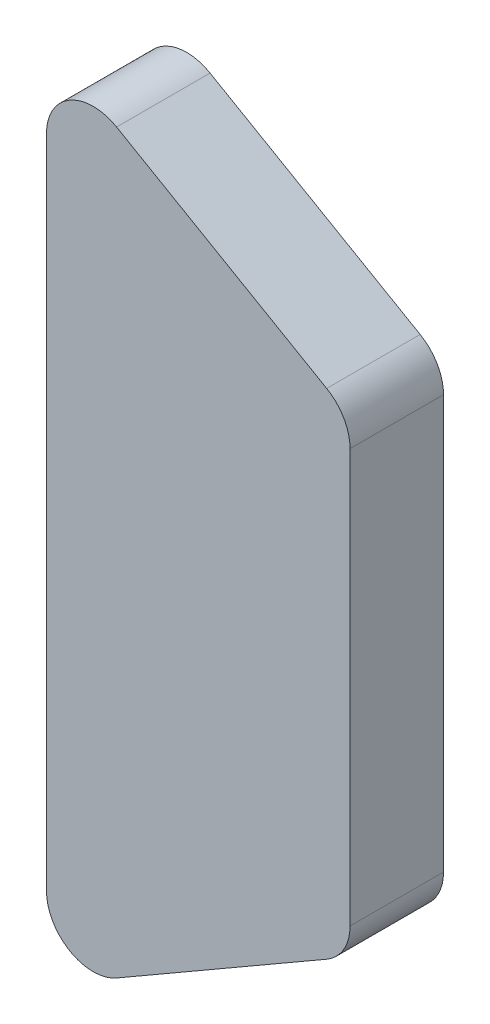
ISO-10303-21;
HEADER;
FILE_DESCRIPTION(('STEP AP214'),'2;1');
FILE_NAME('part.step','',(''),(''),'','','');
FILE_SCHEMA(('AUTOMOTIVE_DESIGN { 1 0 10303 214 1 1 1 1 }'));
ENDSEC;
DATA;
#1=APPLICATION_CONTEXT('core data for automotive mechanical design processes');
#2=APPLICATION_PROTOCOL_DEFINITION('international standard','automotive_design',2000,#1);
#3=PRODUCT_CONTEXT('',#1,'mechanical');
#4=PRODUCT('Part','Part','',(#3));
#5=PRODUCT_RELATED_PRODUCT_CATEGORY('part','',(#4));
#6=PRODUCT_DEFINITION_FORMATION('','',#4);
#7=PRODUCT_DEFINITION_CONTEXT('part definition',#1,'design');
#8=PRODUCT_DEFINITION('design','',#6,#7);
#9=PRODUCT_DEFINITION_SHAPE('','',#8);
#10=(LENGTH_UNIT() NAMED_UNIT(*) SI_UNIT(.MILLI.,.METRE.));
#11=(NAMED_UNIT(*) PLANE_ANGLE_UNIT() SI_UNIT($,.RADIAN.));
#12=(NAMED_UNIT(*) SI_UNIT($,.STERADIAN.) SOLID_ANGLE_UNIT());
#13=UNCERTAINTY_MEASURE_WITH_UNIT(LENGTH_MEASURE(1.E-05),#10,'distance_accuracy_value','');
#14=(GEOMETRIC_REPRESENTATION_CONTEXT(3) GLOBAL_UNCERTAINTY_ASSIGNED_CONTEXT((#13)) GLOBAL_UNIT_ASSIGNED_CONTEXT((#10,
#11,#12)) REPRESENTATION_CONTEXT('',''));
#15=CARTESIAN_POINT('',(0.,0.,0.));
#16=DIRECTION('',(0.,0.,1.));
#17=DIRECTION('',(1.,0.,0.));
#18=AXIS2_PLACEMENT_3D('',#15,#16,#17);
#19=CARTESIAN_POINT('',(6.49519052838329,-5.,2.));
#20=DIRECTION('',(-0.5,0.866025403784439,0.));
#21=DIRECTION('',(-0.866025403784439,-0.5,0.));
#22=AXIS2_PLACEMENT_3D('',#19,#20,#21);
#23=PLANE('',#22);
#24=DIRECTION('',(0.866025403784439,0.5,0.));
#25=VECTOR('',#24,1.);
#26=CARTESIAN_POINT('',(6.49519052838329,-5.,2.));
#27=LINE('',#26,#25);
#28=CARTESIAN_POINT('',(1.5,-7.88397459621556,2.));
#29=VERTEX_POINT('',#28);
#30=CARTESIAN_POINT('',(5.99519052838329,-5.28867513459481,2.));
#31=VERTEX_POINT('',#30);
#32=EDGE_CURVE('E118',#29,#31,#27,.T.);
#33=ORIENTED_EDGE('',*,*,#32,.F.);
#34=DIRECTION('',(0.,0.,-1.));
#35=VECTOR('',#34,1.);
#36=CARTESIAN_POINT('',(1.5,-7.88397459621556,2.));
#37=LINE('',#36,#35);
#38=CARTESIAN_POINT('',(1.5,-7.88397459621556,0.));
#39=VERTEX_POINT('',#38);
#40=EDGE_CURVE('E103',#29,#39,#37,.T.);
#41=ORIENTED_EDGE('',*,*,#40,.T.);
#42=DIRECTION('',(0.866025403784439,0.5,0.));
#43=VECTOR('',#42,1.);
#44=CARTESIAN_POINT('',(6.49519052838329,-5.,0.));
#45=LINE('',#44,#43);
#46=CARTESIAN_POINT('',(5.99519052838329,-5.28867513459481,0.));
#47=VERTEX_POINT('',#46);
#48=EDGE_CURVE('E115',#39,#47,#45,.T.);
#49=ORIENTED_EDGE('',*,*,#48,.T.);
#50=DIRECTION('',(0.,0.,-1.));
#51=VECTOR('',#50,1.);
#52=CARTESIAN_POINT('',(5.99519052838329,-5.28867513459481,2.));
#53=LINE('',#52,#51);
#54=EDGE_CURVE('E120',#47,#31,#53,.F.);
#55=ORIENTED_EDGE('',*,*,#54,.T.);
#56=EDGE_LOOP('',(#33,#41,#49,#55));
#57=FACE_BOUND('',#56,.T.);
#58=ADVANCED_FACE('F33',(#57),#23,.F.);
#59=CARTESIAN_POINT('',(6.49519052838329,5.,2.));
#60=DIRECTION('',(-1.,0.,0.));
#61=DIRECTION('',(0.,0.,1.));
#62=AXIS2_PLACEMENT_3D('',#59,#60,#61);
#63=PLANE('',#62);
#64=DIRECTION('',(0.,1.,0.));
#65=VECTOR('',#64,1.);
#66=CARTESIAN_POINT('',(6.49519052838329,5.,2.));
#67=LINE('',#66,#65);
#68=CARTESIAN_POINT('',(6.49519052838329,-4.42264973081038,2.));
#69=VERTEX_POINT('',#68);
#70=CARTESIAN_POINT('',(6.49519052838329,4.42264973081037,2.));
#71=VERTEX_POINT('',#70);
#72=EDGE_CURVE('E160',#69,#71,#67,.T.);
#73=ORIENTED_EDGE('',*,*,#72,.F.);
#74=DIRECTION('',(0.,0.,-1.));
#75=VECTOR('',#74,1.);
#76=CARTESIAN_POINT('',(6.49519052838329,-4.42264973081038,2.));
#77=LINE('',#76,#75);
#78=CARTESIAN_POINT('',(6.49519052838329,-4.42264973081038,0.));
#79=VERTEX_POINT('',#78);
#80=EDGE_CURVE('E153',#69,#79,#77,.T.);
#81=ORIENTED_EDGE('',*,*,#80,.T.);
#82=DIRECTION('',(0.,1.,0.));
#83=VECTOR('',#82,1.);
#84=CARTESIAN_POINT('',(6.49519052838329,5.,0.));
#85=LINE('',#84,#83);
#86=CARTESIAN_POINT('',(6.49519052838329,4.42264973081037,0.));
#87=VERTEX_POINT('',#86);
#88=EDGE_CURVE('E124',#79,#87,#85,.T.);
#89=ORIENTED_EDGE('',*,*,#88,.T.);
#90=DIRECTION('',(0.,0.,-1.));
#91=VECTOR('',#90,1.);
#92=CARTESIAN_POINT('',(6.49519052838329,4.42264973081037,2.));
#93=LINE('',#92,#91);
#94=EDGE_CURVE('E151',#87,#71,#93,.F.);
#95=ORIENTED_EDGE('',*,*,#94,.T.);
#96=EDGE_LOOP('',(#73,#81,#89,#95));
#97=FACE_BOUND('',#96,.T.);
#98=ADVANCED_FACE('F158',(#97),#63,.F.);
#99=CARTESIAN_POINT('',(0.,8.75,2.));
#100=DIRECTION('',(-0.5,-0.866025403784439,0.));
#101=DIRECTION('',(0.866025403784439,-0.5,0.));
#102=AXIS2_PLACEMENT_3D('',#99,#100,#101);
#103=PLANE('',#102);
#104=DIRECTION('',(-0.866025403784439,0.5,0.));
#105=VECTOR('',#104,1.);
#106=CARTESIAN_POINT('',(0.,8.75,2.));
#107=LINE('',#106,#105);
#108=CARTESIAN_POINT('',(5.99519052838329,5.28867513459481,2.));
#109=VERTEX_POINT('',#108);
#110=CARTESIAN_POINT('',(1.5,7.88397459621556,2.));
#111=VERTEX_POINT('',#110);
#112=EDGE_CURVE('E168',#109,#111,#107,.T.);
#113=ORIENTED_EDGE('',*,*,#112,.F.);
#114=DIRECTION('',(0.,0.,-1.));
#115=VECTOR('',#114,1.);
#116=CARTESIAN_POINT('',(5.99519052838329,5.28867513459481,2.));
#117=LINE('',#116,#115);
#118=CARTESIAN_POINT('',(5.99519052838329,5.28867513459481,0.));
#119=VERTEX_POINT('',#118);
#120=EDGE_CURVE('E11',#109,#119,#117,.T.);
#121=ORIENTED_EDGE('',*,*,#120,.T.);
#122=DIRECTION('',(-0.866025403784439,0.5,0.));
#123=VECTOR('',#122,1.);
#124=CARTESIAN_POINT('',(0.,8.75,0.));
#125=LINE('',#124,#123);
#126=CARTESIAN_POINT('',(1.5,7.88397459621556,0.));
#127=VERTEX_POINT('',#126);
#128=EDGE_CURVE('E127',#119,#127,#125,.T.);
#129=ORIENTED_EDGE('',*,*,#128,.T.);
#130=DIRECTION('',(0.,0.,-1.));
#131=VECTOR('',#130,1.);
#132=CARTESIAN_POINT('',(1.5,7.88397459621556,2.));
#133=LINE('',#132,#131);
#134=EDGE_CURVE('E41',#127,#111,#133,.F.);
#135=ORIENTED_EDGE('',*,*,#134,.T.);
#136=EDGE_LOOP('',(#113,#121,#129,#135));
#137=FACE_BOUND('',#136,.T.);
#138=ADVANCED_FACE('F167',(#137),#103,.F.);
#139=CARTESIAN_POINT('',(0.,-8.75,2.));
#140=DIRECTION('',(1.,0.,0.));
#141=DIRECTION('',(0.,1.,0.));
#142=AXIS2_PLACEMENT_3D('',#139,#140,#141);
#143=PLANE('',#142);
#144=DIRECTION('',(0.,-1.,0.));
#145=VECTOR('',#144,1.);
#146=CARTESIAN_POINT('',(0.,-8.75,0.));
#147=LINE('',#146,#145);
#148=CARTESIAN_POINT('',(0.,7.01794919243112,0.));
#149=VERTEX_POINT('',#148);
#150=CARTESIAN_POINT('',(0.,-7.01794919243112,0.));
#151=VERTEX_POINT('',#150);
#152=EDGE_CURVE('E134',#149,#151,#147,.T.);
#153=ORIENTED_EDGE('',*,*,#152,.T.);
#154=DIRECTION('',(0.,0.,-1.));
#155=VECTOR('',#154,1.);
#156=CARTESIAN_POINT('',(0.,-7.01794919243112,2.));
#157=LINE('',#156,#155);
#158=CARTESIAN_POINT('',(0.,-7.01794919243112,2.));
#159=VERTEX_POINT('',#158);
#160=EDGE_CURVE('E104',#151,#159,#157,.F.);
#161=ORIENTED_EDGE('',*,*,#160,.T.);
#162=DIRECTION('',(0.,-1.,0.));
#163=VECTOR('',#162,1.);
#164=CARTESIAN_POINT('',(0.,-8.75,2.));
#165=LINE('',#164,#163);
#166=CARTESIAN_POINT('',(0.,7.01794919243112,2.));
#167=VERTEX_POINT('',#166);
#168=EDGE_CURVE('E130',#167,#159,#165,.T.);
#169=ORIENTED_EDGE('',*,*,#168,.F.);
#170=DIRECTION('',(0.,0.,-1.));
#171=VECTOR('',#170,1.);
#172=CARTESIAN_POINT('',(0.,7.01794919243112,2.));
#173=LINE('',#172,#171);
#174=EDGE_CURVE('E109',#167,#149,#173,.T.);
#175=ORIENTED_EDGE('',*,*,#174,.T.);
#176=EDGE_LOOP('',(#153,#161,#169,#175));
#177=FACE_BOUND('',#176,.T.);
#178=ADVANCED_FACE('F191',(#177),#143,.F.);
#179=CARTESIAN_POINT('',(0.,0.,2.));
#180=DIRECTION('',(0.,0.,-1.));
#181=DIRECTION('',(-1.,0.,0.));
#182=AXIS2_PLACEMENT_3D('',#179,#180,#181);
#183=PLANE('',#182);
#184=ORIENTED_EDGE('',*,*,#168,.T.);
#185=CARTESIAN_POINT('',(1.,-7.01794919243112,2.));
#186=DIRECTION('',(0.,0.,-1.));
#187=DIRECTION('',(-1.,0.,0.));
#188=AXIS2_PLACEMENT_3D('',#185,#186,#187);
#189=CIRCLE('',#188,1.);
#190=EDGE_CURVE('E149',#159,#29,#189,.F.);
#191=ORIENTED_EDGE('',*,*,#190,.T.);
#192=ORIENTED_EDGE('',*,*,#32,.T.);
#193=CARTESIAN_POINT('',(5.49519052838329,-4.42264973081038,2.));
#194=DIRECTION('',(0.,0.,-1.));
#195=DIRECTION('',(-1.,0.,0.));
#196=AXIS2_PLACEMENT_3D('',#193,#194,#195);
#197=CIRCLE('',#196,1.);
#198=EDGE_CURVE('E147',#31,#69,#197,.F.);
#199=ORIENTED_EDGE('',*,*,#198,.T.);
#200=ORIENTED_EDGE('',*,*,#72,.T.);
#201=CARTESIAN_POINT('',(5.49519052838329,4.42264973081037,2.));
#202=DIRECTION('',(0.,0.,-1.));
#203=DIRECTION('',(-1.,0.,0.));
#204=AXIS2_PLACEMENT_3D('',#201,#202,#203);
#205=CIRCLE('',#204,1.);
#206=EDGE_CURVE('E54',#71,#109,#205,.F.);
#207=ORIENTED_EDGE('',*,*,#206,.T.);
#208=ORIENTED_EDGE('',*,*,#112,.T.);
#209=CARTESIAN_POINT('',(0.999999999999997,7.01794919243112,2.));
#210=DIRECTION('',(0.,0.,-1.));
#211=DIRECTION('',(-1.,0.,0.));
#212=AXIS2_PLACEMENT_3D('',#209,#210,#211);
#213=CIRCLE('',#212,1.);
#214=EDGE_CURVE('E144',#111,#167,#213,.F.);
#215=ORIENTED_EDGE('',*,*,#214,.T.);
#216=EDGE_LOOP('',(#184,#191,#192,#199,#200,#207,#208,#215));
#217=FACE_BOUND('',#216,.T.);
#218=ADVANCED_FACE('F173',(#217),#183,.F.);
#219=CARTESIAN_POINT('',(0.,0.,0.));
#220=DIRECTION('',(0.,0.,-1.));
#221=DIRECTION('',(-1.,0.,0.));
#222=AXIS2_PLACEMENT_3D('',#219,#220,#221);
#223=PLANE('',#222);
#224=ORIENTED_EDGE('',*,*,#48,.F.);
#225=CARTESIAN_POINT('',(1.,-7.01794919243112,0.));
#226=DIRECTION('',(0.,0.,-1.));
#227=DIRECTION('',(-1.,0.,0.));
#228=AXIS2_PLACEMENT_3D('',#225,#226,#227);
#229=CIRCLE('',#228,1.);
#230=EDGE_CURVE('E99',#39,#151,#229,.T.);
#231=ORIENTED_EDGE('',*,*,#230,.T.);
#232=ORIENTED_EDGE('',*,*,#152,.F.);
#233=CARTESIAN_POINT('',(0.999999999999997,7.01794919243112,0.));
#234=DIRECTION('',(0.,0.,-1.));
#235=DIRECTION('',(-1.,0.,0.));
#236=AXIS2_PLACEMENT_3D('',#233,#234,#235);
#237=CIRCLE('',#236,1.);
#238=EDGE_CURVE('E119',#149,#127,#237,.T.);
#239=ORIENTED_EDGE('',*,*,#238,.T.);
#240=ORIENTED_EDGE('',*,*,#128,.F.);
#241=CARTESIAN_POINT('',(5.49519052838329,4.42264973081037,0.));
#242=DIRECTION('',(0.,0.,-1.));
#243=DIRECTION('',(-1.,0.,0.));
#244=AXIS2_PLACEMENT_3D('',#241,#242,#243);
#245=CIRCLE('',#244,1.);
#246=EDGE_CURVE('E138',#119,#87,#245,.T.);
#247=ORIENTED_EDGE('',*,*,#246,.T.);
#248=ORIENTED_EDGE('',*,*,#88,.F.);
#249=CARTESIAN_POINT('',(5.49519052838329,-4.42264973081038,0.));
#250=DIRECTION('',(0.,0.,-1.));
#251=DIRECTION('',(-1.,0.,0.));
#252=AXIS2_PLACEMENT_3D('',#249,#250,#251);
#253=CIRCLE('',#252,1.);
#254=EDGE_CURVE('E110',#79,#47,#253,.T.);
#255=ORIENTED_EDGE('',*,*,#254,.T.);
#256=EDGE_LOOP('',(#224,#231,#232,#239,#240,#247,#248,#255));
#257=FACE_BOUND('',#256,.T.);
#258=ADVANCED_FACE('F122',(#257),#223,.T.);
#259=CARTESIAN_POINT('',(1.,-7.01794919243112,2.));
#260=DIRECTION('',(0.,0.,-1.));
#261=DIRECTION('',(-1.,0.,0.));
#262=AXIS2_PLACEMENT_3D('',#259,#260,#261);
#263=CYLINDRICAL_SURFACE('',#262,1.);
#264=ORIENTED_EDGE('',*,*,#190,.F.);
#265=ORIENTED_EDGE('',*,*,#160,.F.);
#266=ORIENTED_EDGE('',*,*,#230,.F.);
#267=ORIENTED_EDGE('',*,*,#40,.F.);
#268=EDGE_LOOP('',(#264,#265,#266,#267));
#269=FACE_BOUND('',#268,.T.);
#270=ADVANCED_FACE('F102',(#269),#263,.T.);
#271=CARTESIAN_POINT('',(5.49519052838329,-4.42264973081038,2.));
#272=DIRECTION('',(0.,0.,-1.));
#273=DIRECTION('',(-1.,0.,0.));
#274=AXIS2_PLACEMENT_3D('',#271,#272,#273);
#275=CYLINDRICAL_SURFACE('',#274,1.);
#276=ORIENTED_EDGE('',*,*,#198,.F.);
#277=ORIENTED_EDGE('',*,*,#54,.F.);
#278=ORIENTED_EDGE('',*,*,#254,.F.);
#279=ORIENTED_EDGE('',*,*,#80,.F.);
#280=EDGE_LOOP('',(#276,#277,#278,#279));
#281=FACE_BOUND('',#280,.T.);
#282=ADVANCED_FACE('F174',(#281),#275,.T.);
#283=CARTESIAN_POINT('',(5.49519052838329,4.42264973081037,2.));
#284=DIRECTION('',(0.,0.,-1.));
#285=DIRECTION('',(-1.,0.,0.));
#286=AXIS2_PLACEMENT_3D('',#283,#284,#285);
#287=CYLINDRICAL_SURFACE('',#286,1.);
#288=ORIENTED_EDGE('',*,*,#206,.F.);
#289=ORIENTED_EDGE('',*,*,#94,.F.);
#290=ORIENTED_EDGE('',*,*,#246,.F.);
#291=ORIENTED_EDGE('',*,*,#120,.F.);
#292=EDGE_LOOP('',(#288,#289,#290,#291));
#293=FACE_BOUND('',#292,.T.);
#294=ADVANCED_FACE('F166',(#293),#287,.T.);
#295=CARTESIAN_POINT('',(0.999999999999997,7.01794919243112,2.));
#296=DIRECTION('',(0.,0.,-1.));
#297=DIRECTION('',(-1.,0.,0.));
#298=AXIS2_PLACEMENT_3D('',#295,#296,#297);
#299=CYLINDRICAL_SURFACE('',#298,1.);
#300=ORIENTED_EDGE('',*,*,#214,.F.);
#301=ORIENTED_EDGE('',*,*,#134,.F.);
#302=ORIENTED_EDGE('',*,*,#238,.F.);
#303=ORIENTED_EDGE('',*,*,#174,.F.);
#304=EDGE_LOOP('',(#300,#301,#302,#303));
#305=FACE_BOUND('',#304,.T.);
#306=ADVANCED_FACE('F35',(#305),#299,.T.);
#307=CLOSED_SHELL('',(#58,#98,#138,#178,#218,#258,#270,#282,#294,#306));
#308=MANIFOLD_SOLID_BREP('B2',#307);
#309=ADVANCED_BREP_SHAPE_REPRESENTATION('',(#18,#308),#14);
#310=SHAPE_DEFINITION_REPRESENTATION(#9,#309);
ENDSEC;
END-ISO-10303-21;
